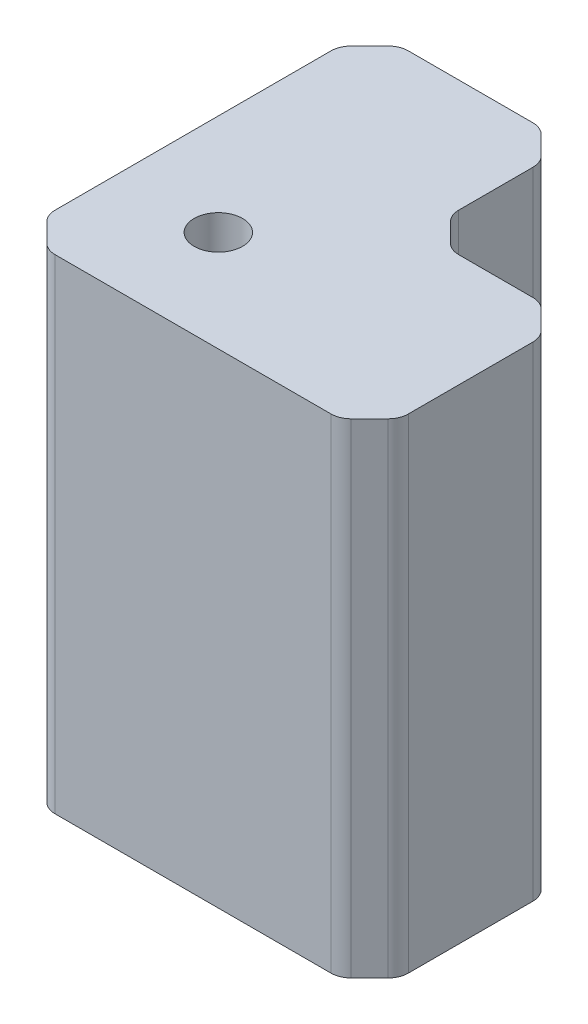
ISO-10303-21;
HEADER;
FILE_DESCRIPTION(('STEP AP214'),'2;1');
FILE_NAME('part.step','',(''),(''),'','','');
FILE_SCHEMA(('AUTOMOTIVE_DESIGN { 1 0 10303 214 1 1 1 1 }'));
ENDSEC;
DATA;
#1=APPLICATION_CONTEXT('core data for automotive mechanical design processes');
#2=APPLICATION_PROTOCOL_DEFINITION('international standard','automotive_design',2000,#1);
#3=PRODUCT_CONTEXT('',#1,'mechanical');
#4=PRODUCT('Part','Part','',(#3));
#5=PRODUCT_RELATED_PRODUCT_CATEGORY('part','',(#4));
#6=PRODUCT_DEFINITION_FORMATION('','',#4);
#7=PRODUCT_DEFINITION_CONTEXT('part definition',#1,'design');
#8=PRODUCT_DEFINITION('design','',#6,#7);
#9=PRODUCT_DEFINITION_SHAPE('','',#8);
#10=(LENGTH_UNIT() NAMED_UNIT(*) SI_UNIT(.MILLI.,.METRE.));
#11=(NAMED_UNIT(*) PLANE_ANGLE_UNIT() SI_UNIT($,.RADIAN.));
#12=(NAMED_UNIT(*) SI_UNIT($,.STERADIAN.) SOLID_ANGLE_UNIT());
#13=UNCERTAINTY_MEASURE_WITH_UNIT(LENGTH_MEASURE(1.E-05),#10,'distance_accuracy_value','');
#14=(GEOMETRIC_REPRESENTATION_CONTEXT(3) GLOBAL_UNCERTAINTY_ASSIGNED_CONTEXT((#13)) GLOBAL_UNIT_ASSIGNED_CONTEXT((#10,
#11,#12)) REPRESENTATION_CONTEXT('',''));
#15=CARTESIAN_POINT('',(0.,0.,0.));
#16=DIRECTION('',(0.,0.,1.));
#17=DIRECTION('',(1.,0.,0.));
#18=AXIS2_PLACEMENT_3D('',#15,#16,#17);
#19=CARTESIAN_POINT('',(0.,48.,0.));
#20=DIRECTION('',(0.,1.,0.));
#21=DIRECTION('',(0.,0.,1.));
#22=AXIS2_PLACEMENT_3D('',#19,#20,#21);
#23=CYLINDRICAL_SURFACE('',#22,2.39999999999999);
#24=CARTESIAN_POINT('',(0.,48.,0.));
#25=DIRECTION('',(0.,1.,0.));
#26=DIRECTION('',(0.,0.,1.));
#27=AXIS2_PLACEMENT_3D('',#24,#25,#26);
#28=CIRCLE('',#27,2.39999999999999);
#29=CARTESIAN_POINT('',(0.,48.,2.39999999999999));
#30=VERTEX_POINT('',#29);
#31=EDGE_CURVE('E365',#30,#30,#28,.T.);
#32=ORIENTED_EDGE('',*,*,#31,.T.);
#33=EDGE_LOOP('',(#32));
#34=FACE_BOUND('',#33,.T.);
#35=CARTESIAN_POINT('',(0.,2.,0.));
#36=DIRECTION('',(0.,-1.,0.));
#37=DIRECTION('',(0.,0.,-1.));
#38=AXIS2_PLACEMENT_3D('',#35,#36,#37);
#39=CIRCLE('',#38,2.39999999999999);
#40=CARTESIAN_POINT('',(0.,2.,-2.39999999999999));
#41=VERTEX_POINT('',#40);
#42=EDGE_CURVE('E376',#41,#41,#39,.F.);
#43=ORIENTED_EDGE('',*,*,#42,.F.);
#44=EDGE_LOOP('',(#43));
#45=FACE_BOUND('',#44,.T.);
#46=ADVANCED_FACE('F41',(#34,#45),#23,.F.);
#47=CARTESIAN_POINT('',(25.,48.,10.));
#48=DIRECTION('',(0.,0.,-1.));
#49=DIRECTION('',(-1.,0.,0.));
#50=AXIS2_PLACEMENT_3D('',#47,#48,#49);
#51=PLANE('',#50);
#52=DIRECTION('',(1.,0.,0.));
#53=VECTOR('',#52,1.);
#54=CARTESIAN_POINT('',(-10.,48.,10.));
#55=LINE('',#54,#53);
#56=CARTESIAN_POINT('',(-6.17157287525381,48.,10.));
#57=VERTEX_POINT('',#56);
#58=CARTESIAN_POINT('',(21.1715728752538,48.,10.));
#59=VERTEX_POINT('',#58);
#60=EDGE_CURVE('E226',#57,#59,#55,.T.);
#61=ORIENTED_EDGE('',*,*,#60,.F.);
#62=DIRECTION('',(0.,1.,0.));
#63=VECTOR('',#62,1.);
#64=CARTESIAN_POINT('',(-6.17157287525381,0.,10.));
#65=LINE('',#64,#63);
#66=CARTESIAN_POINT('',(-6.1715728752538,0.,10.));
#67=VERTEX_POINT('',#66);
#68=EDGE_CURVE('E279',#57,#67,#65,.F.);
#69=ORIENTED_EDGE('',*,*,#68,.T.);
#70=DIRECTION('',(1.,0.,0.));
#71=VECTOR('',#70,1.);
#72=CARTESIAN_POINT('',(25.,0.,10.));
#73=LINE('',#72,#71);
#74=CARTESIAN_POINT('',(21.1715728752538,0.,10.));
#75=VERTEX_POINT('',#74);
#76=EDGE_CURVE('E362',#67,#75,#73,.T.);
#77=ORIENTED_EDGE('',*,*,#76,.T.);
#78=DIRECTION('',(0.,-1.,0.));
#79=VECTOR('',#78,1.);
#80=CARTESIAN_POINT('',(21.1715728752538,48.,10.));
#81=LINE('',#80,#79);
#82=EDGE_CURVE('E276',#75,#59,#81,.F.);
#83=ORIENTED_EDGE('',*,*,#82,.T.);
#84=EDGE_LOOP('',(#61,#69,#77,#83));
#85=FACE_BOUND('',#84,.T.);
#86=ADVANCED_FACE('F438',(#85),#51,.F.);
#87=CARTESIAN_POINT('',(25.,48.,-10.));
#88=DIRECTION('',(-1.,0.,0.));
#89=DIRECTION('',(0.,0.,1.));
#90=AXIS2_PLACEMENT_3D('',#87,#88,#89);
#91=PLANE('',#90);
#92=DIRECTION('',(0.,0.,-1.));
#93=VECTOR('',#92,1.);
#94=CARTESIAN_POINT('',(25.,48.,-10.));
#95=LINE('',#94,#93);
#96=CARTESIAN_POINT('',(25.,48.,6.17157287525382));
#97=VERTEX_POINT('',#96);
#98=CARTESIAN_POINT('',(25.,48.,-6.1715728752538));
#99=VERTEX_POINT('',#98);
#100=EDGE_CURVE('E358',#97,#99,#95,.T.);
#101=ORIENTED_EDGE('',*,*,#100,.F.);
#102=DIRECTION('',(0.,1.,0.));
#103=VECTOR('',#102,1.);
#104=CARTESIAN_POINT('',(25.,0.,6.17157287525382));
#105=LINE('',#104,#103);
#106=CARTESIAN_POINT('',(25.,0.,6.17157287525382));
#107=VERTEX_POINT('',#106);
#108=EDGE_CURVE('E288',#97,#107,#105,.F.);
#109=ORIENTED_EDGE('',*,*,#108,.T.);
#110=DIRECTION('',(0.,0.,-1.));
#111=VECTOR('',#110,1.);
#112=CARTESIAN_POINT('',(25.,0.,-10.));
#113=LINE('',#112,#111);
#114=CARTESIAN_POINT('',(25.,0.,-6.1715728752538));
#115=VERTEX_POINT('',#114);
#116=EDGE_CURVE('E364',#107,#115,#113,.T.);
#117=ORIENTED_EDGE('',*,*,#116,.T.);
#118=DIRECTION('',(0.,-1.,0.));
#119=VECTOR('',#118,1.);
#120=CARTESIAN_POINT('',(25.,48.,-6.1715728752538));
#121=LINE('',#120,#119);
#122=EDGE_CURVE('E285',#115,#99,#121,.F.);
#123=ORIENTED_EDGE('',*,*,#122,.T.);
#124=EDGE_LOOP('',(#101,#109,#117,#123));
#125=FACE_BOUND('',#124,.T.);
#126=ADVANCED_FACE('F445',(#125),#91,.F.);
#127=CARTESIAN_POINT('',(10.,48.,-10.));
#128=DIRECTION('',(0.,0.,1.));
#129=DIRECTION('',(1.,0.,0.));
#130=AXIS2_PLACEMENT_3D('',#127,#128,#129);
#131=PLANE('',#130);
#132=DIRECTION('',(-1.,0.,0.));
#133=VECTOR('',#132,1.);
#134=CARTESIAN_POINT('',(10.,48.,-10.));
#135=LINE('',#134,#133);
#136=CARTESIAN_POINT('',(21.1715728752538,48.,-10.));
#137=VERTEX_POINT('',#136);
#138=CARTESIAN_POINT('',(13.8284271247462,48.,-10.));
#139=VERTEX_POINT('',#138);
#140=EDGE_CURVE('E352',#137,#139,#135,.T.);
#141=ORIENTED_EDGE('',*,*,#140,.F.);
#142=DIRECTION('',(0.,1.,0.));
#143=VECTOR('',#142,1.);
#144=CARTESIAN_POINT('',(21.1715728752538,0.,-10.));
#145=LINE('',#144,#143);
#146=CARTESIAN_POINT('',(21.1715728752538,0.,-10.));
#147=VERTEX_POINT('',#146);
#148=EDGE_CURVE('E298',#137,#147,#145,.F.);
#149=ORIENTED_EDGE('',*,*,#148,.T.);
#150=DIRECTION('',(-1.,0.,0.));
#151=VECTOR('',#150,1.);
#152=CARTESIAN_POINT('',(10.,0.,-10.));
#153=LINE('',#152,#151);
#154=CARTESIAN_POINT('',(13.8284271247462,0.,-10.));
#155=VERTEX_POINT('',#154);
#156=EDGE_CURVE('E368',#147,#155,#153,.T.);
#157=ORIENTED_EDGE('',*,*,#156,.T.);
#158=DIRECTION('',(0.,-1.,0.));
#159=VECTOR('',#158,1.);
#160=CARTESIAN_POINT('',(13.8284271247462,48.,-10.));
#161=LINE('',#160,#159);
#162=EDGE_CURVE('E295',#155,#139,#161,.F.);
#163=ORIENTED_EDGE('',*,*,#162,.T.);
#164=EDGE_LOOP('',(#141,#149,#157,#163));
#165=FACE_BOUND('',#164,.T.);
#166=ADVANCED_FACE('F466',(#165),#131,.F.);
#167=CARTESIAN_POINT('',(10.,48.,-25.));
#168=DIRECTION('',(-1.,0.,0.));
#169=DIRECTION('',(0.,0.,1.));
#170=AXIS2_PLACEMENT_3D('',#167,#168,#169);
#171=PLANE('',#170);
#172=DIRECTION('',(0.,0.,-1.));
#173=VECTOR('',#172,1.);
#174=CARTESIAN_POINT('',(10.,48.,-25.));
#175=LINE('',#174,#173);
#176=CARTESIAN_POINT('',(10.,48.,-13.8284271247462));
#177=VERTEX_POINT('',#176);
#178=CARTESIAN_POINT('',(10.,48.,-21.1715728752538));
#179=VERTEX_POINT('',#178);
#180=EDGE_CURVE('E347',#177,#179,#175,.T.);
#181=ORIENTED_EDGE('',*,*,#180,.F.);
#182=DIRECTION('',(0.,1.,0.));
#183=VECTOR('',#182,1.);
#184=CARTESIAN_POINT('',(10.,0.,-13.8284271247462));
#185=LINE('',#184,#183);
#186=CARTESIAN_POINT('',(10.,0.,-13.8284271247462));
#187=VERTEX_POINT('',#186);
#188=EDGE_CURVE('E308',#177,#187,#185,.F.);
#189=ORIENTED_EDGE('',*,*,#188,.T.);
#190=DIRECTION('',(0.,0.,-1.));
#191=VECTOR('',#190,1.);
#192=CARTESIAN_POINT('',(10.,0.,-25.));
#193=LINE('',#192,#191);
#194=CARTESIAN_POINT('',(10.,0.,-21.1715728752538));
#195=VERTEX_POINT('',#194);
#196=EDGE_CURVE('E335',#187,#195,#193,.T.);
#197=ORIENTED_EDGE('',*,*,#196,.T.);
#198=DIRECTION('',(0.,-1.,0.));
#199=VECTOR('',#198,1.);
#200=CARTESIAN_POINT('',(10.,48.,-21.1715728752538));
#201=LINE('',#200,#199);
#202=EDGE_CURVE('E305',#195,#179,#201,.F.);
#203=ORIENTED_EDGE('',*,*,#202,.T.);
#204=EDGE_LOOP('',(#181,#189,#197,#203));
#205=FACE_BOUND('',#204,.T.);
#206=ADVANCED_FACE('F349',(#205),#171,.F.);
#207=CARTESIAN_POINT('',(-10.,48.,-25.));
#208=DIRECTION('',(0.,0.,1.));
#209=DIRECTION('',(1.,0.,0.));
#210=AXIS2_PLACEMENT_3D('',#207,#208,#209);
#211=PLANE('',#210);
#212=DIRECTION('',(-1.,0.,0.));
#213=VECTOR('',#212,1.);
#214=CARTESIAN_POINT('',(-10.,48.,-25.));
#215=LINE('',#214,#213);
#216=CARTESIAN_POINT('',(6.17157287525382,48.,-25.));
#217=VERTEX_POINT('',#216);
#218=CARTESIAN_POINT('',(-6.1715728752538,48.,-25.));
#219=VERTEX_POINT('',#218);
#220=EDGE_CURVE('E351',#217,#219,#215,.T.);
#221=ORIENTED_EDGE('',*,*,#220,.F.);
#222=DIRECTION('',(0.,1.,0.));
#223=VECTOR('',#222,1.);
#224=CARTESIAN_POINT('',(6.17157287525382,0.,-25.));
#225=LINE('',#224,#223);
#226=CARTESIAN_POINT('',(6.17157287525382,0.,-25.));
#227=VERTEX_POINT('',#226);
#228=EDGE_CURVE('E314',#217,#227,#225,.F.);
#229=ORIENTED_EDGE('',*,*,#228,.T.);
#230=DIRECTION('',(-1.,0.,0.));
#231=VECTOR('',#230,1.);
#232=CARTESIAN_POINT('',(-10.,0.,-25.));
#233=LINE('',#232,#231);
#234=CARTESIAN_POINT('',(-6.1715728752538,0.,-25.));
#235=VERTEX_POINT('',#234);
#236=EDGE_CURVE('E372',#227,#235,#233,.T.);
#237=ORIENTED_EDGE('',*,*,#236,.T.);
#238=DIRECTION('',(0.,-1.,0.));
#239=VECTOR('',#238,1.);
#240=CARTESIAN_POINT('',(-6.1715728752538,48.,-25.));
#241=LINE('',#240,#239);
#242=EDGE_CURVE('E311',#235,#219,#241,.F.);
#243=ORIENTED_EDGE('',*,*,#242,.T.);
#244=EDGE_LOOP('',(#221,#229,#237,#243));
#245=FACE_BOUND('',#244,.T.);
#246=ADVANCED_FACE('F415',(#245),#211,.F.);
#247=CARTESIAN_POINT('',(-10.,48.,-10.));
#248=DIRECTION('',(1.,0.,0.));
#249=DIRECTION('',(0.,0.,-1.));
#250=AXIS2_PLACEMENT_3D('',#247,#248,#249);
#251=PLANE('',#250);
#252=DIRECTION('',(0.,0.,1.));
#253=VECTOR('',#252,1.);
#254=CARTESIAN_POINT('',(-10.,0.,-10.));
#255=LINE('',#254,#253);
#256=CARTESIAN_POINT('',(-10.,0.,-21.1715728752538));
#257=VERTEX_POINT('',#256);
#258=CARTESIAN_POINT('',(-10.,0.,6.1715728752538));
#259=VERTEX_POINT('',#258);
#260=EDGE_CURVE('E227',#257,#259,#255,.T.);
#261=ORIENTED_EDGE('',*,*,#260,.T.);
#262=DIRECTION('',(0.,-1.,0.));
#263=VECTOR('',#262,1.);
#264=CARTESIAN_POINT('',(-10.,48.,6.1715728752538));
#265=LINE('',#264,#263);
#266=CARTESIAN_POINT('',(-10.,48.,6.1715728752538));
#267=VERTEX_POINT('',#266);
#268=EDGE_CURVE('E225',#259,#267,#265,.F.);
#269=ORIENTED_EDGE('',*,*,#268,.T.);
#270=DIRECTION('',(0.,0.,1.));
#271=VECTOR('',#270,1.);
#272=CARTESIAN_POINT('',(-10.,48.,-10.));
#273=LINE('',#272,#271);
#274=CARTESIAN_POINT('',(-10.,48.,-21.1715728752538));
#275=VERTEX_POINT('',#274);
#276=EDGE_CURVE('E208',#275,#267,#273,.T.);
#277=ORIENTED_EDGE('',*,*,#276,.F.);
#278=DIRECTION('',(0.,1.,0.));
#279=VECTOR('',#278,1.);
#280=CARTESIAN_POINT('',(-10.,0.,-21.1715728752538));
#281=LINE('',#280,#279);
#282=EDGE_CURVE('E222',#275,#257,#281,.F.);
#283=ORIENTED_EDGE('',*,*,#282,.T.);
#284=EDGE_LOOP('',(#261,#269,#277,#283));
#285=FACE_BOUND('',#284,.T.);
#286=ADVANCED_FACE('F221',(#285),#251,.F.);
#287=CARTESIAN_POINT('',(0.,48.,0.));
#288=DIRECTION('',(0.,1.,0.));
#289=DIRECTION('',(0.,0.,1.));
#290=AXIS2_PLACEMENT_3D('',#287,#288,#289);
#291=PLANE('',#290);
#292=ORIENTED_EDGE('',*,*,#31,.F.);
#293=EDGE_LOOP('',(#292));
#294=FACE_BOUND('',#293,.T.);
#295=ORIENTED_EDGE('',*,*,#276,.T.);
#296=CARTESIAN_POINT('',(-8.,48.,6.1715728752538));
#297=DIRECTION('',(0.,1.,0.));
#298=DIRECTION('',(0.,0.,1.));
#299=AXIS2_PLACEMENT_3D('',#296,#297,#298);
#300=CIRCLE('',#299,2.);
#301=CARTESIAN_POINT('',(-9.4142135623731,48.,7.58578643762689));
#302=VERTEX_POINT('',#301);
#303=EDGE_CURVE('E253',#267,#302,#300,.T.);
#304=ORIENTED_EDGE('',*,*,#303,.T.);
#305=DIRECTION('',(-0.707106781186546,0.,-0.707106781186549));
#306=VECTOR('',#305,1.);
#307=CARTESIAN_POINT('',(-8.50000000000001,48.,8.49999999999998));
#308=LINE('',#307,#306);
#309=CARTESIAN_POINT('',(-7.5857864376269,48.,9.41421356237309));
#310=VERTEX_POINT('',#309);
#311=EDGE_CURVE('E392',#302,#310,#308,.F.);
#312=ORIENTED_EDGE('',*,*,#311,.T.);
#313=CARTESIAN_POINT('',(-6.17157287525381,48.,8.));
#314=DIRECTION('',(0.,1.,0.));
#315=DIRECTION('',(0.,0.,1.));
#316=AXIS2_PLACEMENT_3D('',#313,#314,#315);
#317=CIRCLE('',#316,2.);
#318=EDGE_CURVE('E251',#310,#57,#317,.T.);
#319=ORIENTED_EDGE('',*,*,#318,.T.);
#320=ORIENTED_EDGE('',*,*,#60,.T.);
#321=CARTESIAN_POINT('',(21.1715728752538,48.,8.));
#322=DIRECTION('',(0.,1.,0.));
#323=DIRECTION('',(0.,0.,1.));
#324=AXIS2_PLACEMENT_3D('',#321,#322,#323);
#325=CIRCLE('',#324,2.);
#326=CARTESIAN_POINT('',(22.5857864376269,48.,9.4142135623731));
#327=VERTEX_POINT('',#326);
#328=EDGE_CURVE('E249',#59,#327,#325,.T.);
#329=ORIENTED_EDGE('',*,*,#328,.T.);
#330=DIRECTION('',(-0.707106781186548,0.,0.707106781186547));
#331=VECTOR('',#330,1.);
#332=CARTESIAN_POINT('',(16.,48.,16.));
#333=LINE('',#332,#331);
#334=CARTESIAN_POINT('',(24.4142135623731,48.,7.58578643762691));
#335=VERTEX_POINT('',#334);
#336=EDGE_CURVE('E395',#327,#335,#333,.F.);
#337=ORIENTED_EDGE('',*,*,#336,.T.);
#338=CARTESIAN_POINT('',(23.,48.,6.17157287525382));
#339=DIRECTION('',(0.,1.,0.));
#340=DIRECTION('',(0.,0.,1.));
#341=AXIS2_PLACEMENT_3D('',#338,#339,#340);
#342=CIRCLE('',#341,2.);
#343=EDGE_CURVE('E247',#335,#97,#342,.T.);
#344=ORIENTED_EDGE('',*,*,#343,.T.);
#345=ORIENTED_EDGE('',*,*,#100,.T.);
#346=CARTESIAN_POINT('',(23.,48.,-6.1715728752538));
#347=DIRECTION('',(0.,1.,0.));
#348=DIRECTION('',(0.,0.,1.));
#349=AXIS2_PLACEMENT_3D('',#346,#347,#348);
#350=CIRCLE('',#349,2.);
#351=CARTESIAN_POINT('',(24.4142135623731,48.,-7.5857864376269));
#352=VERTEX_POINT('',#351);
#353=EDGE_CURVE('E245',#99,#352,#350,.T.);
#354=ORIENTED_EDGE('',*,*,#353,.T.);
#355=DIRECTION('',(0.707106781186547,0.,0.707106781186548));
#356=VECTOR('',#355,1.);
#357=CARTESIAN_POINT('',(16.,48.,-16.));
#358=LINE('',#357,#356);
#359=CARTESIAN_POINT('',(22.5857864376269,48.,-9.41421356237309));
#360=VERTEX_POINT('',#359);
#361=EDGE_CURVE('E398',#352,#360,#358,.F.);
#362=ORIENTED_EDGE('',*,*,#361,.T.);
#363=CARTESIAN_POINT('',(21.1715728752538,48.,-8.));
#364=DIRECTION('',(0.,1.,0.));
#365=DIRECTION('',(0.,0.,1.));
#366=AXIS2_PLACEMENT_3D('',#363,#364,#365);
#367=CIRCLE('',#366,2.);
#368=EDGE_CURVE('E243',#360,#137,#367,.T.);
#369=ORIENTED_EDGE('',*,*,#368,.T.);
#370=ORIENTED_EDGE('',*,*,#140,.T.);
#371=CARTESIAN_POINT('',(13.8284271247462,48.,-12.));
#372=DIRECTION('',(0.,1.,0.));
#373=DIRECTION('',(0.,0.,1.));
#374=AXIS2_PLACEMENT_3D('',#371,#372,#373);
#375=CIRCLE('',#374,2.);
#376=CARTESIAN_POINT('',(12.4142135623731,48.,-10.5857864376269));
#377=VERTEX_POINT('',#376);
#378=EDGE_CURVE('E325',#139,#377,#375,.F.);
#379=ORIENTED_EDGE('',*,*,#378,.T.);
#380=DIRECTION('',(0.707106781186544,0.,0.707106781186551));
#381=VECTOR('',#380,1.);
#382=CARTESIAN_POINT('',(10.,48.,-13.));
#383=LINE('',#382,#381);
#384=CARTESIAN_POINT('',(10.5857864376269,48.,-12.4142135623731));
#385=VERTEX_POINT('',#384);
#386=EDGE_CURVE('E231',#377,#385,#383,.F.);
#387=ORIENTED_EDGE('',*,*,#386,.T.);
#388=CARTESIAN_POINT('',(12.,48.,-13.8284271247462));
#389=DIRECTION('',(0.,1.,0.));
#390=DIRECTION('',(0.,0.,1.));
#391=AXIS2_PLACEMENT_3D('',#388,#389,#390);
#392=CIRCLE('',#391,2.);
#393=EDGE_CURVE('E11',#385,#177,#392,.F.);
#394=ORIENTED_EDGE('',*,*,#393,.T.);
#395=ORIENTED_EDGE('',*,*,#180,.T.);
#396=CARTESIAN_POINT('',(8.,48.,-21.1715728752538));
#397=DIRECTION('',(0.,1.,0.));
#398=DIRECTION('',(0.,0.,1.));
#399=AXIS2_PLACEMENT_3D('',#396,#397,#398);
#400=CIRCLE('',#399,2.);
#401=CARTESIAN_POINT('',(9.4142135623731,48.,-22.5857864376269));
#402=VERTEX_POINT('',#401);
#403=EDGE_CURVE('E215',#179,#402,#400,.T.);
#404=ORIENTED_EDGE('',*,*,#403,.T.);
#405=DIRECTION('',(0.707106781186547,0.,0.707106781186548));
#406=VECTOR('',#405,1.);
#407=CARTESIAN_POINT('',(16.,48.,-16.));
#408=LINE('',#407,#406);
#409=CARTESIAN_POINT('',(7.58578643762691,48.,-24.4142135623731));
#410=VERTEX_POINT('',#409);
#411=EDGE_CURVE('E401',#402,#410,#408,.F.);
#412=ORIENTED_EDGE('',*,*,#411,.T.);
#413=CARTESIAN_POINT('',(6.17157287525382,48.,-23.));
#414=DIRECTION('',(0.,1.,0.));
#415=DIRECTION('',(0.,0.,1.));
#416=AXIS2_PLACEMENT_3D('',#413,#414,#415);
#417=CIRCLE('',#416,2.);
#418=EDGE_CURVE('E241',#410,#217,#417,.T.);
#419=ORIENTED_EDGE('',*,*,#418,.T.);
#420=ORIENTED_EDGE('',*,*,#220,.T.);
#421=CARTESIAN_POINT('',(-6.1715728752538,48.,-23.));
#422=DIRECTION('',(0.,1.,0.));
#423=DIRECTION('',(0.,0.,1.));
#424=AXIS2_PLACEMENT_3D('',#421,#422,#423);
#425=CIRCLE('',#424,2.);
#426=CARTESIAN_POINT('',(-7.5857864376269,48.,-24.4142135623731));
#427=VERTEX_POINT('',#426);
#428=EDGE_CURVE('E214',#219,#427,#425,.T.);
#429=ORIENTED_EDGE('',*,*,#428,.T.);
#430=DIRECTION('',(0.707106781186548,0.,-0.707106781186547));
#431=VECTOR('',#430,1.);
#432=CARTESIAN_POINT('',(-16.,48.,-16.));
#433=LINE('',#432,#431);
#434=CARTESIAN_POINT('',(-9.41421356237309,48.,-22.5857864376269));
#435=VERTEX_POINT('',#434);
#436=EDGE_CURVE('E210',#427,#435,#433,.F.);
#437=ORIENTED_EDGE('',*,*,#436,.T.);
#438=CARTESIAN_POINT('',(-8.,48.,-21.1715728752538));
#439=DIRECTION('',(0.,1.,0.));
#440=DIRECTION('',(0.,0.,1.));
#441=AXIS2_PLACEMENT_3D('',#438,#439,#440);
#442=CIRCLE('',#441,2.);
#443=EDGE_CURVE('E205',#435,#275,#442,.T.);
#444=ORIENTED_EDGE('',*,*,#443,.T.);
#445=EDGE_LOOP('',(#295,#304,#312,#319,#320,#329,#337,#344,#345,#354,#362,#369,#370,#379,#387,
#394,#395,#404,#412,#419,#420,#429,#437,#444));
#446=FACE_BOUND('',#445,.T.);
#447=ADVANCED_FACE('F207',(#294,#446),#291,.T.);
#448=CARTESIAN_POINT('',(0.,0.,0.));
#449=DIRECTION('',(0.,1.,0.));
#450=DIRECTION('',(0.,0.,1.));
#451=AXIS2_PLACEMENT_3D('',#448,#449,#450);
#452=PLANE('',#451);
#453=CARTESIAN_POINT('',(0.,0.,0.));
#454=DIRECTION('',(0.,-1.,0.));
#455=DIRECTION('',(0.,0.,-1.));
#456=AXIS2_PLACEMENT_3D('',#453,#454,#455);
#457=CIRCLE('',#456,5.);
#458=CARTESIAN_POINT('',(0.,0.,-5.));
#459=VERTEX_POINT('',#458);
#460=EDGE_CURVE('E720',#459,#459,#457,.T.);
#461=ORIENTED_EDGE('',*,*,#460,.F.);
#462=EDGE_LOOP('',(#461));
#463=FACE_BOUND('',#462,.T.);
#464=DIRECTION('',(0.707106781186546,0.,0.707106781186549));
#465=VECTOR('',#464,1.);
#466=CARTESIAN_POINT('',(-7.,0.,10.));
#467=LINE('',#466,#465);
#468=CARTESIAN_POINT('',(-7.5857864376269,0.,9.41421356237309));
#469=VERTEX_POINT('',#468);
#470=CARTESIAN_POINT('',(-9.4142135623731,0.,7.58578643762689));
#471=VERTEX_POINT('',#470);
#472=EDGE_CURVE('E355',#469,#471,#467,.F.);
#473=ORIENTED_EDGE('',*,*,#472,.T.);
#474=CARTESIAN_POINT('',(-8.,0.,6.1715728752538));
#475=DIRECTION('',(0.,1.,0.));
#476=DIRECTION('',(0.,0.,1.));
#477=AXIS2_PLACEMENT_3D('',#474,#475,#476);
#478=CIRCLE('',#477,2.);
#479=EDGE_CURVE('E274',#471,#259,#478,.F.);
#480=ORIENTED_EDGE('',*,*,#479,.T.);
#481=ORIENTED_EDGE('',*,*,#260,.F.);
#482=CARTESIAN_POINT('',(-8.,0.,-21.1715728752538));
#483=DIRECTION('',(0.,1.,0.));
#484=DIRECTION('',(0.,0.,1.));
#485=AXIS2_PLACEMENT_3D('',#482,#483,#484);
#486=CIRCLE('',#485,2.);
#487=CARTESIAN_POINT('',(-9.41421356237309,0.,-22.5857864376269));
#488=VERTEX_POINT('',#487);
#489=EDGE_CURVE('E230',#257,#488,#486,.F.);
#490=ORIENTED_EDGE('',*,*,#489,.T.);
#491=DIRECTION('',(-0.707106781186548,0.,0.707106781186547));
#492=VECTOR('',#491,1.);
#493=CARTESIAN_POINT('',(-10.,0.,-22.));
#494=LINE('',#493,#492);
#495=CARTESIAN_POINT('',(-7.5857864376269,0.,-24.4142135623731));
#496=VERTEX_POINT('',#495);
#497=EDGE_CURVE('E389',#488,#496,#494,.F.);
#498=ORIENTED_EDGE('',*,*,#497,.T.);
#499=CARTESIAN_POINT('',(-6.1715728752538,0.,-23.));
#500=DIRECTION('',(0.,1.,0.));
#501=DIRECTION('',(0.,0.,1.));
#502=AXIS2_PLACEMENT_3D('',#499,#500,#501);
#503=CIRCLE('',#502,2.);
#504=EDGE_CURVE('E262',#496,#235,#503,.F.);
#505=ORIENTED_EDGE('',*,*,#504,.T.);
#506=ORIENTED_EDGE('',*,*,#236,.F.);
#507=CARTESIAN_POINT('',(6.17157287525382,0.,-23.));
#508=DIRECTION('',(0.,1.,0.));
#509=DIRECTION('',(0.,0.,1.));
#510=AXIS2_PLACEMENT_3D('',#507,#508,#509);
#511=CIRCLE('',#510,2.);
#512=CARTESIAN_POINT('',(7.58578643762691,0.,-24.4142135623731));
#513=VERTEX_POINT('',#512);
#514=EDGE_CURVE('E264',#227,#513,#511,.F.);
#515=ORIENTED_EDGE('',*,*,#514,.T.);
#516=DIRECTION('',(-0.707106781186547,0.,-0.707106781186548));
#517=VECTOR('',#516,1.);
#518=CARTESIAN_POINT('',(7.,0.,-25.));
#519=LINE('',#518,#517);
#520=CARTESIAN_POINT('',(9.4142135623731,0.,-22.5857864376269));
#521=VERTEX_POINT('',#520);
#522=EDGE_CURVE('E386',#513,#521,#519,.F.);
#523=ORIENTED_EDGE('',*,*,#522,.T.);
#524=CARTESIAN_POINT('',(8.,0.,-21.1715728752538));
#525=DIRECTION('',(0.,1.,0.));
#526=DIRECTION('',(0.,0.,1.));
#527=AXIS2_PLACEMENT_3D('',#524,#525,#526);
#528=CIRCLE('',#527,2.);
#529=EDGE_CURVE('E259',#521,#195,#528,.F.);
#530=ORIENTED_EDGE('',*,*,#529,.T.);
#531=ORIENTED_EDGE('',*,*,#196,.F.);
#532=CARTESIAN_POINT('',(12.,0.,-13.8284271247462));
#533=DIRECTION('',(0.,1.,0.));
#534=DIRECTION('',(0.,0.,1.));
#535=AXIS2_PLACEMENT_3D('',#532,#533,#534);
#536=CIRCLE('',#535,2.);
#537=CARTESIAN_POINT('',(10.5857864376269,0.,-12.4142135623731));
#538=VERTEX_POINT('',#537);
#539=EDGE_CURVE('E49',#187,#538,#536,.T.);
#540=ORIENTED_EDGE('',*,*,#539,.T.);
#541=DIRECTION('',(-0.707106781186544,0.,-0.707106781186551));
#542=VECTOR('',#541,1.);
#543=CARTESIAN_POINT('',(11.5000000000001,0.,-11.4999999999999));
#544=LINE('',#543,#542);
#545=CARTESIAN_POINT('',(12.4142135623731,0.,-10.5857864376269));
#546=VERTEX_POINT('',#545);
#547=EDGE_CURVE('E235',#538,#546,#544,.F.);
#548=ORIENTED_EDGE('',*,*,#547,.T.);
#549=CARTESIAN_POINT('',(13.8284271247462,0.,-12.));
#550=DIRECTION('',(0.,1.,0.));
#551=DIRECTION('',(0.,0.,1.));
#552=AXIS2_PLACEMENT_3D('',#549,#550,#551);
#553=CIRCLE('',#552,2.);
#554=EDGE_CURVE('E327',#546,#155,#553,.T.);
#555=ORIENTED_EDGE('',*,*,#554,.T.);
#556=ORIENTED_EDGE('',*,*,#156,.F.);
#557=CARTESIAN_POINT('',(21.1715728752538,0.,-8.));
#558=DIRECTION('',(0.,1.,0.));
#559=DIRECTION('',(0.,0.,1.));
#560=AXIS2_PLACEMENT_3D('',#557,#558,#559);
#561=CIRCLE('',#560,2.);
#562=CARTESIAN_POINT('',(22.5857864376269,0.,-9.41421356237309));
#563=VERTEX_POINT('',#562);
#564=EDGE_CURVE('E266',#147,#563,#561,.F.);
#565=ORIENTED_EDGE('',*,*,#564,.T.);
#566=DIRECTION('',(-0.707106781186547,0.,-0.707106781186548));
#567=VECTOR('',#566,1.);
#568=CARTESIAN_POINT('',(22.,0.,-10.));
#569=LINE('',#568,#567);
#570=CARTESIAN_POINT('',(24.4142135623731,0.,-7.5857864376269));
#571=VERTEX_POINT('',#570);
#572=EDGE_CURVE('E383',#563,#571,#569,.F.);
#573=ORIENTED_EDGE('',*,*,#572,.T.);
#574=CARTESIAN_POINT('',(23.,0.,-6.1715728752538));
#575=DIRECTION('',(0.,1.,0.));
#576=DIRECTION('',(0.,0.,1.));
#577=AXIS2_PLACEMENT_3D('',#574,#575,#576);
#578=CIRCLE('',#577,2.);
#579=EDGE_CURVE('E268',#571,#115,#578,.F.);
#580=ORIENTED_EDGE('',*,*,#579,.T.);
#581=ORIENTED_EDGE('',*,*,#116,.F.);
#582=CARTESIAN_POINT('',(23.,0.,6.17157287525382));
#583=DIRECTION('',(0.,1.,0.));
#584=DIRECTION('',(0.,0.,1.));
#585=AXIS2_PLACEMENT_3D('',#582,#583,#584);
#586=CIRCLE('',#585,2.);
#587=CARTESIAN_POINT('',(24.4142135623731,0.,7.58578643762691));
#588=VERTEX_POINT('',#587);
#589=EDGE_CURVE('E270',#107,#588,#586,.F.);
#590=ORIENTED_EDGE('',*,*,#589,.T.);
#591=DIRECTION('',(0.707106781186548,0.,-0.707106781186547));
#592=VECTOR('',#591,1.);
#593=CARTESIAN_POINT('',(25.,0.,7.));
#594=LINE('',#593,#592);
#595=CARTESIAN_POINT('',(22.5857864376269,0.,9.4142135623731));
#596=VERTEX_POINT('',#595);
#597=EDGE_CURVE('E381',#588,#596,#594,.F.);
#598=ORIENTED_EDGE('',*,*,#597,.T.);
#599=CARTESIAN_POINT('',(21.1715728752538,0.,8.));
#600=DIRECTION('',(0.,1.,0.));
#601=DIRECTION('',(0.,0.,1.));
#602=AXIS2_PLACEMENT_3D('',#599,#600,#601);
#603=CIRCLE('',#602,2.);
#604=EDGE_CURVE('E56',#596,#75,#603,.F.);
#605=ORIENTED_EDGE('',*,*,#604,.T.);
#606=ORIENTED_EDGE('',*,*,#76,.F.);
#607=CARTESIAN_POINT('',(-6.17157287525381,0.,8.));
#608=DIRECTION('',(0.,1.,0.));
#609=DIRECTION('',(0.,0.,1.));
#610=AXIS2_PLACEMENT_3D('',#607,#608,#609);
#611=CIRCLE('',#610,2.);
#612=EDGE_CURVE('E64',#67,#469,#611,.F.);
#613=ORIENTED_EDGE('',*,*,#612,.T.);
#614=EDGE_LOOP('',(#473,#480,#481,#490,#498,#505,#506,#515,#523,#530,#531,#540,#548,#555,#556,
#565,#573,#580,#581,#590,#598,#605,#606,#613));
#615=FACE_BOUND('',#614,.T.);
#616=ADVANCED_FACE('F332',(#463,#615),#452,.F.);
#617=CARTESIAN_POINT('',(0.,2.,0.));
#618=DIRECTION('',(0.,-1.,0.));
#619=DIRECTION('',(0.,0.,-1.));
#620=AXIS2_PLACEMENT_3D('',#617,#618,#619);
#621=PLANE('',#620);
#622=CARTESIAN_POINT('',(0.,2.,0.));
#623=DIRECTION('',(0.,-1.,0.));
#624=DIRECTION('',(0.,0.,-1.));
#625=AXIS2_PLACEMENT_3D('',#622,#623,#624);
#626=CIRCLE('',#625,5.);
#627=CARTESIAN_POINT('',(0.,2.,-5.));
#628=VERTEX_POINT('',#627);
#629=EDGE_CURVE('E379',#628,#628,#626,.T.);
#630=ORIENTED_EDGE('',*,*,#629,.T.);
#631=EDGE_LOOP('',(#630));
#632=FACE_BOUND('',#631,.T.);
#633=ORIENTED_EDGE('',*,*,#42,.T.);
#634=EDGE_LOOP('',(#633));
#635=FACE_BOUND('',#634,.T.);
#636=ADVANCED_FACE('F458',(#632,#635),#621,.T.);
#637=CARTESIAN_POINT('',(0.,2.,0.));
#638=DIRECTION('',(0.,-1.,0.));
#639=DIRECTION('',(0.,0.,-1.));
#640=AXIS2_PLACEMENT_3D('',#637,#638,#639);
#641=CYLINDRICAL_SURFACE('',#640,5.);
#642=ORIENTED_EDGE('',*,*,#629,.F.);
#643=EDGE_LOOP('',(#642));
#644=FACE_BOUND('',#643,.T.);
#645=ORIENTED_EDGE('',*,*,#460,.T.);
#646=EDGE_LOOP('',(#645));
#647=FACE_BOUND('',#646,.T.);
#648=ADVANCED_FACE('F434',(#644,#647),#641,.F.);
#649=CARTESIAN_POINT('',(10.,48.,-13.));
#650=DIRECTION('',(0.707106781186551,0.,-0.707106781186544));
#651=DIRECTION('',(0.,1.,0.));
#652=AXIS2_PLACEMENT_3D('',#649,#650,#651);
#653=PLANE('',#652);
#654=ORIENTED_EDGE('',*,*,#386,.F.);
#655=DIRECTION('',(0.,1.,0.));
#656=VECTOR('',#655,1.);
#657=CARTESIAN_POINT('',(12.4142135623731,0.,-10.5857864376269));
#658=LINE('',#657,#656);
#659=EDGE_CURVE('E303',#377,#546,#658,.F.);
#660=ORIENTED_EDGE('',*,*,#659,.T.);
#661=ORIENTED_EDGE('',*,*,#547,.F.);
#662=DIRECTION('',(0.,-1.,0.));
#663=VECTOR('',#662,1.);
#664=CARTESIAN_POINT('',(10.5857864376269,48.,-12.4142135623731));
#665=LINE('',#664,#663);
#666=EDGE_CURVE('E301',#538,#385,#665,.F.);
#667=ORIENTED_EDGE('',*,*,#666,.T.);
#668=EDGE_LOOP('',(#654,#660,#661,#667));
#669=FACE_BOUND('',#668,.T.);
#670=ADVANCED_FACE('F341',(#669),#653,.T.);
#671=CARTESIAN_POINT('',(-10.,48.,-22.));
#672=DIRECTION('',(0.707106781186547,0.,0.707106781186548));
#673=DIRECTION('',(0.,-1.,0.));
#674=AXIS2_PLACEMENT_3D('',#671,#672,#673);
#675=PLANE('',#674);
#676=ORIENTED_EDGE('',*,*,#436,.F.);
#677=DIRECTION('',(0.,1.,0.));
#678=VECTOR('',#677,1.);
#679=CARTESIAN_POINT('',(-7.5857864376269,0.,-24.4142135623731));
#680=LINE('',#679,#678);
#681=EDGE_CURVE('E323',#427,#496,#680,.F.);
#682=ORIENTED_EDGE('',*,*,#681,.T.);
#683=ORIENTED_EDGE('',*,*,#497,.F.);
#684=DIRECTION('',(0.,-1.,0.));
#685=VECTOR('',#684,1.);
#686=CARTESIAN_POINT('',(-9.41421356237309,48.,-22.5857864376269));
#687=LINE('',#686,#685);
#688=EDGE_CURVE('E321',#488,#435,#687,.F.);
#689=ORIENTED_EDGE('',*,*,#688,.T.);
#690=EDGE_LOOP('',(#676,#682,#683,#689));
#691=FACE_BOUND('',#690,.T.);
#692=ADVANCED_FACE('F424',(#691),#675,.F.);
#693=CARTESIAN_POINT('',(7.,48.,-25.));
#694=DIRECTION('',(-0.707106781186548,0.,0.707106781186547));
#695=DIRECTION('',(0.,-1.,0.));
#696=AXIS2_PLACEMENT_3D('',#693,#694,#695);
#697=PLANE('',#696);
#698=ORIENTED_EDGE('',*,*,#522,.F.);
#699=DIRECTION('',(0.,-1.,0.));
#700=VECTOR('',#699,1.);
#701=CARTESIAN_POINT('',(7.58578643762691,48.,-24.4142135623731));
#702=LINE('',#701,#700);
#703=EDGE_CURVE('E319',#513,#410,#702,.F.);
#704=ORIENTED_EDGE('',*,*,#703,.T.);
#705=ORIENTED_EDGE('',*,*,#411,.F.);
#706=DIRECTION('',(0.,1.,0.));
#707=VECTOR('',#706,1.);
#708=CARTESIAN_POINT('',(9.4142135623731,0.,-22.5857864376269));
#709=LINE('',#708,#707);
#710=EDGE_CURVE('E317',#402,#521,#709,.F.);
#711=ORIENTED_EDGE('',*,*,#710,.T.);
#712=EDGE_LOOP('',(#698,#704,#705,#711));
#713=FACE_BOUND('',#712,.T.);
#714=ADVANCED_FACE('F426',(#713),#697,.F.);
#715=CARTESIAN_POINT('',(22.,48.,-10.));
#716=DIRECTION('',(-0.707106781186548,0.,0.707106781186547));
#717=DIRECTION('',(0.,-1.,0.));
#718=AXIS2_PLACEMENT_3D('',#715,#716,#717);
#719=PLANE('',#718);
#720=ORIENTED_EDGE('',*,*,#361,.F.);
#721=DIRECTION('',(0.,1.,0.));
#722=VECTOR('',#721,1.);
#723=CARTESIAN_POINT('',(24.4142135623731,0.,-7.5857864376269));
#724=LINE('',#723,#722);
#725=EDGE_CURVE('E293',#352,#571,#724,.F.);
#726=ORIENTED_EDGE('',*,*,#725,.T.);
#727=ORIENTED_EDGE('',*,*,#572,.F.);
#728=DIRECTION('',(0.,-1.,0.));
#729=VECTOR('',#728,1.);
#730=CARTESIAN_POINT('',(22.5857864376269,48.,-9.41421356237309));
#731=LINE('',#730,#729);
#732=EDGE_CURVE('E291',#563,#360,#731,.F.);
#733=ORIENTED_EDGE('',*,*,#732,.T.);
#734=EDGE_LOOP('',(#720,#726,#727,#733));
#735=FACE_BOUND('',#734,.T.);
#736=ADVANCED_FACE('F432',(#735),#719,.F.);
#737=CARTESIAN_POINT('',(25.,48.,7.));
#738=DIRECTION('',(-0.707106781186547,0.,-0.707106781186548));
#739=DIRECTION('',(0.,-1.,0.));
#740=AXIS2_PLACEMENT_3D('',#737,#738,#739);
#741=PLANE('',#740);
#742=ORIENTED_EDGE('',*,*,#336,.F.);
#743=DIRECTION('',(0.,1.,0.));
#744=VECTOR('',#743,1.);
#745=CARTESIAN_POINT('',(22.5857864376269,0.,9.4142135623731));
#746=LINE('',#745,#744);
#747=EDGE_CURVE('E283',#327,#596,#746,.F.);
#748=ORIENTED_EDGE('',*,*,#747,.T.);
#749=ORIENTED_EDGE('',*,*,#597,.F.);
#750=DIRECTION('',(0.,-1.,0.));
#751=VECTOR('',#750,1.);
#752=CARTESIAN_POINT('',(24.4142135623731,48.,7.58578643762691));
#753=LINE('',#752,#751);
#754=EDGE_CURVE('E281',#588,#335,#753,.F.);
#755=ORIENTED_EDGE('',*,*,#754,.T.);
#756=EDGE_LOOP('',(#742,#748,#749,#755));
#757=FACE_BOUND('',#756,.T.);
#758=ADVANCED_FACE('F489',(#757),#741,.F.);
#759=CARTESIAN_POINT('',(-7.,48.,10.));
#760=DIRECTION('',(0.707106781186549,0.,-0.707106781186546));
#761=DIRECTION('',(0.,-1.,0.));
#762=AXIS2_PLACEMENT_3D('',#759,#760,#761);
#763=PLANE('',#762);
#764=ORIENTED_EDGE('',*,*,#311,.F.);
#765=DIRECTION('',(0.,1.,0.));
#766=VECTOR('',#765,1.);
#767=CARTESIAN_POINT('',(-9.4142135623731,0.,7.58578643762689));
#768=LINE('',#767,#766);
#769=EDGE_CURVE('E257',#302,#471,#768,.F.);
#770=ORIENTED_EDGE('',*,*,#769,.T.);
#771=ORIENTED_EDGE('',*,*,#472,.F.);
#772=DIRECTION('',(0.,-1.,0.));
#773=VECTOR('',#772,1.);
#774=CARTESIAN_POINT('',(-7.5857864376269,48.,9.41421356237309));
#775=LINE('',#774,#773);
#776=EDGE_CURVE('E255',#469,#310,#775,.F.);
#777=ORIENTED_EDGE('',*,*,#776,.T.);
#778=EDGE_LOOP('',(#764,#770,#771,#777));
#779=FACE_BOUND('',#778,.T.);
#780=ADVANCED_FACE('F493',(#779),#763,.F.);
#781=CARTESIAN_POINT('',(-8.,48.,6.1715728752538));
#782=DIRECTION('',(0.,1.,0.));
#783=DIRECTION('',(0.,0.,1.));
#784=AXIS2_PLACEMENT_3D('',#781,#782,#783);
#785=CYLINDRICAL_SURFACE('',#784,2.);
#786=ORIENTED_EDGE('',*,*,#479,.F.);
#787=ORIENTED_EDGE('',*,*,#769,.F.);
#788=ORIENTED_EDGE('',*,*,#303,.F.);
#789=ORIENTED_EDGE('',*,*,#268,.F.);
#790=EDGE_LOOP('',(#786,#787,#788,#789));
#791=FACE_BOUND('',#790,.T.);
#792=ADVANCED_FACE('F496',(#791),#785,.T.);
#793=CARTESIAN_POINT('',(-6.17157287525381,48.,8.));
#794=DIRECTION('',(0.,-1.,0.));
#795=DIRECTION('',(0.,0.,-1.));
#796=AXIS2_PLACEMENT_3D('',#793,#794,#795);
#797=CYLINDRICAL_SURFACE('',#796,2.);
#798=ORIENTED_EDGE('',*,*,#318,.F.);
#799=ORIENTED_EDGE('',*,*,#776,.F.);
#800=ORIENTED_EDGE('',*,*,#612,.F.);
#801=ORIENTED_EDGE('',*,*,#68,.F.);
#802=EDGE_LOOP('',(#798,#799,#800,#801));
#803=FACE_BOUND('',#802,.T.);
#804=ADVANCED_FACE('F500',(#803),#797,.T.);
#805=CARTESIAN_POINT('',(21.1715728752538,48.,8.));
#806=DIRECTION('',(0.,1.,0.));
#807=DIRECTION('',(0.,0.,1.));
#808=AXIS2_PLACEMENT_3D('',#805,#806,#807);
#809=CYLINDRICAL_SURFACE('',#808,2.);
#810=ORIENTED_EDGE('',*,*,#604,.F.);
#811=ORIENTED_EDGE('',*,*,#747,.F.);
#812=ORIENTED_EDGE('',*,*,#328,.F.);
#813=ORIENTED_EDGE('',*,*,#82,.F.);
#814=EDGE_LOOP('',(#810,#811,#812,#813));
#815=FACE_BOUND('',#814,.T.);
#816=ADVANCED_FACE('F504',(#815),#809,.T.);
#817=CARTESIAN_POINT('',(23.,48.,6.17157287525382));
#818=DIRECTION('',(0.,-1.,0.));
#819=DIRECTION('',(0.,0.,-1.));
#820=AXIS2_PLACEMENT_3D('',#817,#818,#819);
#821=CYLINDRICAL_SURFACE('',#820,2.);
#822=ORIENTED_EDGE('',*,*,#343,.F.);
#823=ORIENTED_EDGE('',*,*,#754,.F.);
#824=ORIENTED_EDGE('',*,*,#589,.F.);
#825=ORIENTED_EDGE('',*,*,#108,.F.);
#826=EDGE_LOOP('',(#822,#823,#824,#825));
#827=FACE_BOUND('',#826,.T.);
#828=ADVANCED_FACE('F507',(#827),#821,.T.);
#829=CARTESIAN_POINT('',(23.,48.,-6.1715728752538));
#830=DIRECTION('',(0.,1.,0.));
#831=DIRECTION('',(0.,0.,1.));
#832=AXIS2_PLACEMENT_3D('',#829,#830,#831);
#833=CYLINDRICAL_SURFACE('',#832,2.);
#834=ORIENTED_EDGE('',*,*,#579,.F.);
#835=ORIENTED_EDGE('',*,*,#725,.F.);
#836=ORIENTED_EDGE('',*,*,#353,.F.);
#837=ORIENTED_EDGE('',*,*,#122,.F.);
#838=EDGE_LOOP('',(#834,#835,#836,#837));
#839=FACE_BOUND('',#838,.T.);
#840=ADVANCED_FACE('F511',(#839),#833,.T.);
#841=CARTESIAN_POINT('',(21.1715728752538,48.,-8.));
#842=DIRECTION('',(0.,-1.,0.));
#843=DIRECTION('',(0.,0.,-1.));
#844=AXIS2_PLACEMENT_3D('',#841,#842,#843);
#845=CYLINDRICAL_SURFACE('',#844,2.);
#846=ORIENTED_EDGE('',*,*,#368,.F.);
#847=ORIENTED_EDGE('',*,*,#732,.F.);
#848=ORIENTED_EDGE('',*,*,#564,.F.);
#849=ORIENTED_EDGE('',*,*,#148,.F.);
#850=EDGE_LOOP('',(#846,#847,#848,#849));
#851=FACE_BOUND('',#850,.T.);
#852=ADVANCED_FACE('F515',(#851),#845,.T.);
#853=CARTESIAN_POINT('',(13.8284271247462,48.,-12.));
#854=DIRECTION('',(0.,1.,0.));
#855=DIRECTION('',(0.,0.,1.));
#856=AXIS2_PLACEMENT_3D('',#853,#854,#855);
#857=CYLINDRICAL_SURFACE('',#856,2.);
#858=ORIENTED_EDGE('',*,*,#554,.F.);
#859=ORIENTED_EDGE('',*,*,#659,.F.);
#860=ORIENTED_EDGE('',*,*,#378,.F.);
#861=ORIENTED_EDGE('',*,*,#162,.F.);
#862=EDGE_LOOP('',(#858,#859,#860,#861));
#863=FACE_BOUND('',#862,.T.);
#864=ADVANCED_FACE('F519',(#863),#857,.F.);
#865=CARTESIAN_POINT('',(12.,48.,-13.8284271247462));
#866=DIRECTION('',(0.,-1.,0.));
#867=DIRECTION('',(0.,0.,-1.));
#868=AXIS2_PLACEMENT_3D('',#865,#866,#867);
#869=CYLINDRICAL_SURFACE('',#868,2.);
#870=ORIENTED_EDGE('',*,*,#393,.F.);
#871=ORIENTED_EDGE('',*,*,#666,.F.);
#872=ORIENTED_EDGE('',*,*,#539,.F.);
#873=ORIENTED_EDGE('',*,*,#188,.F.);
#874=EDGE_LOOP('',(#870,#871,#872,#873));
#875=FACE_BOUND('',#874,.T.);
#876=ADVANCED_FACE('F344',(#875),#869,.F.);
#877=CARTESIAN_POINT('',(6.17157287525382,48.,-23.));
#878=DIRECTION('',(0.,-1.,0.));
#879=DIRECTION('',(0.,0.,-1.));
#880=AXIS2_PLACEMENT_3D('',#877,#878,#879);
#881=CYLINDRICAL_SURFACE('',#880,2.);
#882=ORIENTED_EDGE('',*,*,#418,.F.);
#883=ORIENTED_EDGE('',*,*,#703,.F.);
#884=ORIENTED_EDGE('',*,*,#514,.F.);
#885=ORIENTED_EDGE('',*,*,#228,.F.);
#886=EDGE_LOOP('',(#882,#883,#884,#885));
#887=FACE_BOUND('',#886,.T.);
#888=ADVANCED_FACE('F412',(#887),#881,.T.);
#889=CARTESIAN_POINT('',(-6.1715728752538,48.,-23.));
#890=DIRECTION('',(0.,1.,0.));
#891=DIRECTION('',(0.,0.,1.));
#892=AXIS2_PLACEMENT_3D('',#889,#890,#891);
#893=CYLINDRICAL_SURFACE('',#892,2.);
#894=ORIENTED_EDGE('',*,*,#504,.F.);
#895=ORIENTED_EDGE('',*,*,#681,.F.);
#896=ORIENTED_EDGE('',*,*,#428,.F.);
#897=ORIENTED_EDGE('',*,*,#242,.F.);
#898=EDGE_LOOP('',(#894,#895,#896,#897));
#899=FACE_BOUND('',#898,.T.);
#900=ADVANCED_FACE('F422',(#899),#893,.T.);
#901=CARTESIAN_POINT('',(-8.,48.,-21.1715728752538));
#902=DIRECTION('',(0.,-1.,0.));
#903=DIRECTION('',(0.,0.,-1.));
#904=AXIS2_PLACEMENT_3D('',#901,#902,#903);
#905=CYLINDRICAL_SURFACE('',#904,2.);
#906=ORIENTED_EDGE('',*,*,#443,.F.);
#907=ORIENTED_EDGE('',*,*,#688,.F.);
#908=ORIENTED_EDGE('',*,*,#489,.F.);
#909=ORIENTED_EDGE('',*,*,#282,.F.);
#910=EDGE_LOOP('',(#906,#907,#908,#909));
#911=FACE_BOUND('',#910,.T.);
#912=ADVANCED_FACE('F229',(#911),#905,.T.);
#913=CARTESIAN_POINT('',(8.,48.,-21.1715728752538));
#914=DIRECTION('',(0.,1.,0.));
#915=DIRECTION('',(0.,0.,1.));
#916=AXIS2_PLACEMENT_3D('',#913,#914,#915);
#917=CYLINDRICAL_SURFACE('',#916,2.);
#918=ORIENTED_EDGE('',*,*,#529,.F.);
#919=ORIENTED_EDGE('',*,*,#710,.F.);
#920=ORIENTED_EDGE('',*,*,#403,.F.);
#921=ORIENTED_EDGE('',*,*,#202,.F.);
#922=EDGE_LOOP('',(#918,#919,#920,#921));
#923=FACE_BOUND('',#922,.T.);
#924=ADVANCED_FACE('F43',(#923),#917,.T.);
#925=CLOSED_SHELL('',(#46,#86,#126,#166,#206,#246,#286,#447,#616,#636,#648,#670,#692,#714,#736,
#758,#780,#792,#804,#816,#828,#840,#852,#864,#876,#888,#900,#912,#924));
#926=MANIFOLD_SOLID_BREP('B2',#925);
#927=ADVANCED_BREP_SHAPE_REPRESENTATION('',(#18,#926),#14);
#928=SHAPE_DEFINITION_REPRESENTATION(#9,#927);
ENDSEC;
END-ISO-10303-21;
